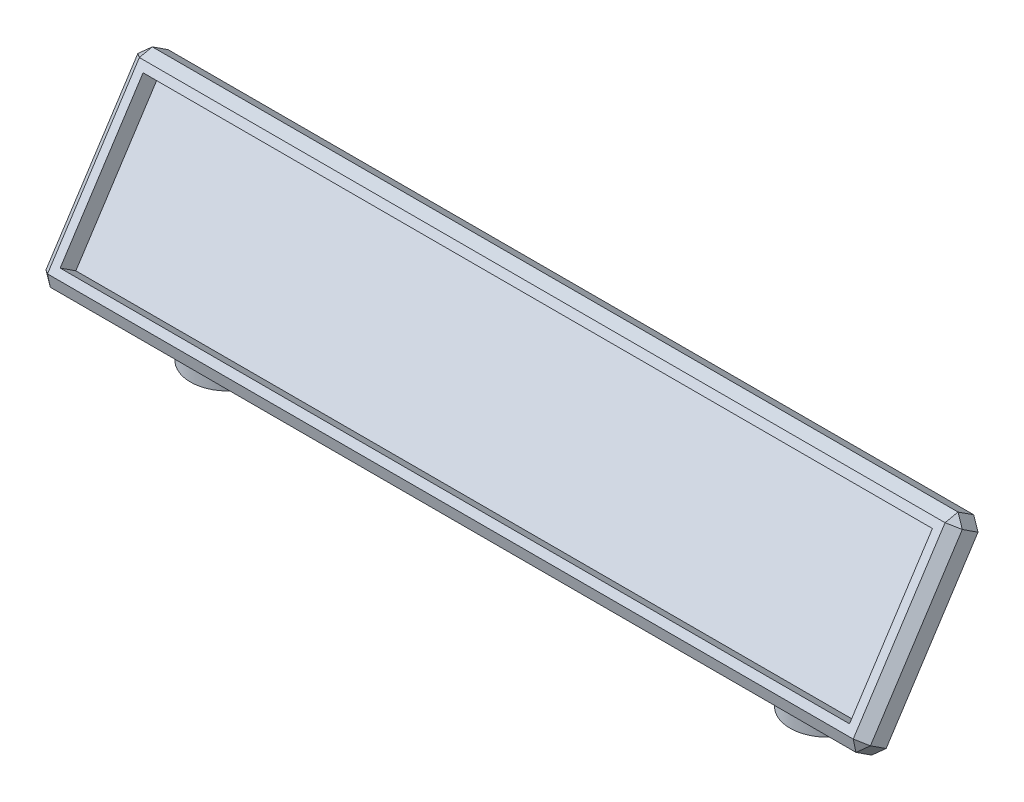
ISO-10303-21;
HEADER;
FILE_DESCRIPTION(('STEP AP214'),'2;1');
FILE_NAME('part.step','',(''),(''),'','','');
FILE_SCHEMA(('AUTOMOTIVE_DESIGN { 1 0 10303 214 1 1 1 1 }'));
ENDSEC;
DATA;
#1=APPLICATION_CONTEXT('core data for automotive mechanical design processes');
#2=APPLICATION_PROTOCOL_DEFINITION('international standard','automotive_design',2000,#1);
#3=PRODUCT_CONTEXT('',#1,'mechanical');
#4=PRODUCT('Part','Part','',(#3));
#5=PRODUCT_RELATED_PRODUCT_CATEGORY('part','',(#4));
#6=PRODUCT_DEFINITION_FORMATION('','',#4);
#7=PRODUCT_DEFINITION_CONTEXT('part definition',#1,'design');
#8=PRODUCT_DEFINITION('design','',#6,#7);
#9=PRODUCT_DEFINITION_SHAPE('','',#8);
#10=(LENGTH_UNIT() NAMED_UNIT(*) SI_UNIT(.MILLI.,.METRE.));
#11=(NAMED_UNIT(*) PLANE_ANGLE_UNIT() SI_UNIT($,.RADIAN.));
#12=(NAMED_UNIT(*) SI_UNIT($,.STERADIAN.) SOLID_ANGLE_UNIT());
#13=UNCERTAINTY_MEASURE_WITH_UNIT(LENGTH_MEASURE(1.E-05),#10,'distance_accuracy_value','');
#14=(GEOMETRIC_REPRESENTATION_CONTEXT(3) GLOBAL_UNCERTAINTY_ASSIGNED_CONTEXT((#13)) GLOBAL_UNIT_ASSIGNED_CONTEXT((#10,
#11,#12)) REPRESENTATION_CONTEXT('',''));
#15=CARTESIAN_POINT('',(0.,0.,0.));
#16=DIRECTION('',(0.,0.,1.));
#17=DIRECTION('',(1.,0.,0.));
#18=AXIS2_PLACEMENT_3D('',#15,#16,#17);
#19=CARTESIAN_POINT('',(0.,5.65083347470303,8.70152048404579));
#20=DIRECTION('',(0.,0.544639035015028,0.838670567945423));
#21=DIRECTION('',(0.,-0.838670567945423,0.544639035015028));
#22=AXIS2_PLACEMENT_3D('',#19,#20,#21);
#23=PLANE('',#22);
#24=DIRECTION('',(-1.,0.,0.));
#25=VECTOR('',#24,1.);
#26=CARTESIAN_POINT('',(-69.85,7.06749426047978,7.78153021277722));
#27=LINE('',#26,#25);
#28=CARTESIAN_POINT('',(68.2625,7.06749426047977,7.78153021277721));
#29=VERTEX_POINT('',#28);
#30=CARTESIAN_POINT('',(-68.2625,7.06749426047978,7.78153021277722));
#31=VERTEX_POINT('',#30);
#32=EDGE_CURVE('E252',#29,#31,#27,.T.);
#33=ORIENTED_EDGE('',*,*,#32,.T.);
#34=DIRECTION('',(0.,0.838670567945423,-0.544639035015028));
#35=VECTOR('',#34,1.);
#36=CARTESIAN_POINT('',(-68.2625,5.65083347470303,8.70152048404579));
#37=LINE('',#36,#35);
#38=CARTESIAN_POINT('',(-68.2625,31.0325057395202,-7.7815302127772));
#39=VERTEX_POINT('',#38);
#40=EDGE_CURVE('E261',#31,#39,#37,.T.);
#41=ORIENTED_EDGE('',*,*,#40,.T.);
#42=DIRECTION('',(1.,0.,0.));
#43=VECTOR('',#42,1.);
#44=CARTESIAN_POINT('',(0.,31.0325057395202,-7.7815302127772));
#45=LINE('',#44,#43);
#46=CARTESIAN_POINT('',(68.2625,31.0325057395202,-7.78153021277721));
#47=VERTEX_POINT('',#46);
#48=EDGE_CURVE('E258',#39,#47,#45,.T.);
#49=ORIENTED_EDGE('',*,*,#48,.T.);
#50=DIRECTION('',(0.,-0.838670567945423,0.544639035015028));
#51=VECTOR('',#50,1.);
#52=CARTESIAN_POINT('',(68.2625,5.73610473386639,8.64614468086358));
#53=LINE('',#52,#51);
#54=EDGE_CURVE('E255',#47,#29,#53,.T.);
#55=ORIENTED_EDGE('',*,*,#54,.T.);
#56=EDGE_LOOP('',(#33,#41,#49,#55));
#57=FACE_BOUND('',#56,.T.);
#58=CARTESIAN_POINT('',(-50.8,19.05,0.));
#59=DIRECTION('',(0.,0.544639035015028,0.838670567945423));
#60=DIRECTION('',(0.,-0.838670567945423,0.544639035015028));
#61=AXIS2_PLACEMENT_3D('',#58,#59,#60);
#62=ELLIPSE('',#61,11.6590982132318,6.35);
#63=CARTESIAN_POINT('',(-50.8,9.27185747977741,6.35000000000002));
#64=VERTEX_POINT('',#63);
#65=EDGE_CURVE('E227',#64,#64,#62,.T.);
#66=ORIENTED_EDGE('',*,*,#65,.T.);
#67=EDGE_LOOP('',(#66));
#68=FACE_BOUND('',#67,.T.);
#69=CARTESIAN_POINT('',(50.8,19.05,0.));
#70=DIRECTION('',(0.,0.544639035015028,0.838670567945423));
#71=DIRECTION('',(0.,-0.838670567945423,0.544639035015028));
#72=AXIS2_PLACEMENT_3D('',#69,#70,#71);
#73=ELLIPSE('',#72,11.6590982132318,6.35);
#74=CARTESIAN_POINT('',(50.8,9.27185747977745,6.34999999999999));
#75=VERTEX_POINT('',#74);
#76=EDGE_CURVE('E235',#75,#75,#73,.F.);
#77=ORIENTED_EDGE('',*,*,#76,.F.);
#78=EDGE_LOOP('',(#77));
#79=FACE_BOUND('',#78,.T.);
#80=ADVANCED_FACE('F49',(#57,#68,#79),#23,.F.);
#81=CARTESIAN_POINT('',(-50.8,19.05,0.));
#82=DIRECTION('',(0.,-1.,0.));
#83=DIRECTION('',(0.,0.,-1.));
#84=AXIS2_PLACEMENT_3D('',#81,#82,#83);
#85=CYLINDRICAL_SURFACE('',#84,6.35);
#86=CARTESIAN_POINT('',(-50.8,0.,0.));
#87=DIRECTION('',(0.,1.,0.));
#88=DIRECTION('',(0.,0.,1.));
#89=AXIS2_PLACEMENT_3D('',#86,#87,#88);
#90=CIRCLE('',#89,6.35);
#91=CARTESIAN_POINT('',(-50.8,0.,6.35000000000002));
#92=VERTEX_POINT('',#91);
#93=EDGE_CURVE('E231',#92,#92,#90,.T.);
#94=ORIENTED_EDGE('',*,*,#93,.T.);
#95=EDGE_LOOP('',(#94));
#96=FACE_BOUND('',#95,.T.);
#97=ORIENTED_EDGE('',*,*,#65,.F.);
#98=EDGE_LOOP('',(#97));
#99=FACE_BOUND('',#98,.T.);
#100=ADVANCED_FACE('F454',(#96,#99),#85,.T.);
#101=CARTESIAN_POINT('',(-50.8,0.,0.));
#102=DIRECTION('',(0.,1.,0.));
#103=DIRECTION('',(0.,0.,1.));
#104=AXIS2_PLACEMENT_3D('',#101,#102,#103);
#105=PLANE('',#104);
#106=CARTESIAN_POINT('',(-50.8,0.,0.));
#107=DIRECTION('',(0.,-1.,0.));
#108=DIRECTION('',(0.,0.,-1.));
#109=AXIS2_PLACEMENT_3D('',#106,#107,#108);
#110=CIRCLE('',#109,3.17500000000001);
#111=CARTESIAN_POINT('',(-50.8,0.,-3.175));
#112=VERTEX_POINT('',#111);
#113=EDGE_CURVE('E1039',#112,#112,#110,.T.);
#114=ORIENTED_EDGE('',*,*,#113,.F.);
#115=EDGE_LOOP('',(#114));
#116=FACE_BOUND('',#115,.T.);
#117=ORIENTED_EDGE('',*,*,#93,.F.);
#118=EDGE_LOOP('',(#117));
#119=FACE_BOUND('',#118,.T.);
#120=ADVANCED_FACE('F460',(#116,#119),#105,.F.);
#121=CARTESIAN_POINT('',(0.,35.822353138479,-3.32058657441013));
#122=DIRECTION('',(0.,-0.838670567945423,0.544639035015028));
#123=DIRECTION('',(0.,-0.544639035015028,-0.838670567945423));
#124=AXIS2_PLACEMENT_3D('',#121,#122,#123);
#125=PLANE('',#124);
#126=DIRECTION('',(0.,-0.544639035015028,-0.838670567945423));
#127=VECTOR('',#126,1.);
#128=CARTESIAN_POINT('',(68.2625,32.3638952661336,-8.64614468086357));
#129=LINE('',#128,#127);
#130=CARTESIAN_POINT('',(68.2625,34.9577386703927,-4.65197610102351));
#131=VERTEX_POINT('',#130);
#132=CARTESIAN_POINT('',(68.2625,33.22850973422,-7.31475515425019));
#133=VERTEX_POINT('',#132);
#134=EDGE_CURVE('E271',#131,#133,#129,.T.);
#135=ORIENTED_EDGE('',*,*,#134,.T.);
#136=DIRECTION('',(-1.,0.,0.));
#137=VECTOR('',#136,1.);
#138=CARTESIAN_POINT('',(0.,33.22850973422,-7.31475515425019));
#139=LINE('',#138,#137);
#140=CARTESIAN_POINT('',(-68.2625,33.22850973422,-7.31475515425018));
#141=VERTEX_POINT('',#140);
#142=EDGE_CURVE('E274',#133,#141,#139,.T.);
#143=ORIENTED_EDGE('',*,*,#142,.T.);
#144=DIRECTION('',(0.,0.544639035015028,0.838670567945423));
#145=VECTOR('',#144,1.);
#146=CARTESIAN_POINT('',(-68.2625,35.822353138479,-3.32058657441013));
#147=LINE('',#146,#145);
#148=CARTESIAN_POINT('',(-68.2625,34.9577386703927,-4.6519761010235));
#149=VERTEX_POINT('',#148);
#150=EDGE_CURVE('E265',#141,#149,#147,.T.);
#151=ORIENTED_EDGE('',*,*,#150,.T.);
#152=DIRECTION('',(1.,0.,0.));
#153=VECTOR('',#152,1.);
#154=CARTESIAN_POINT('',(69.85,34.9577386703927,-4.65197610102351));
#155=LINE('',#154,#153);
#156=EDGE_CURVE('E268',#149,#131,#155,.T.);
#157=ORIENTED_EDGE('',*,*,#156,.T.);
#158=EDGE_LOOP('',(#135,#143,#151,#157));
#159=FACE_BOUND('',#158,.T.);
#160=ADVANCED_FACE('F415',(#159),#125,.F.);
#161=CARTESIAN_POINT('',(-69.85,9.10929134704846,14.0270785904992));
#162=DIRECTION('',(1.,0.,0.));
#163=DIRECTION('',(0.,1.,0.));
#164=AXIS2_PLACEMENT_3D('',#161,#162,#163);
#165=PLANE('',#164);
#166=DIRECTION('',(0.,-0.544639035015028,-0.838670567945423));
#167=VECTOR('',#166,1.);
#168=CARTESIAN_POINT('',(-69.85,34.4909636118657,-2.45597210632377));
#169=LINE('',#168,#167);
#170=CARTESIAN_POINT('',(-69.85,33.6263491437793,-3.78736163293714));
#171=VERTEX_POINT('',#170);
#172=CARTESIAN_POINT('',(-69.85,31.8971202076066,-6.45014068616384));
#173=VERTEX_POINT('',#172);
#174=EDGE_CURVE('E239',#171,#173,#169,.T.);
#175=ORIENTED_EDGE('',*,*,#174,.T.);
#176=DIRECTION('',(0.,-0.838670567945423,0.544639035015028));
#177=VECTOR('',#176,1.);
#178=CARTESIAN_POINT('',(-69.85,6.51544794278939,10.0329100106592));
#179=LINE('',#178,#177);
#180=CARTESIAN_POINT('',(-69.85,7.93210872856614,9.11291973939058));
#181=VERTEX_POINT('',#180);
#182=EDGE_CURVE('E248',#173,#181,#179,.T.);
#183=ORIENTED_EDGE('',*,*,#182,.T.);
#184=DIRECTION('',(0.,0.544639035015028,0.838670567945423));
#185=VECTOR('',#184,1.);
#186=CARTESIAN_POINT('',(-69.85,10.5259521328252,13.1070883192307));
#187=LINE('',#186,#185);
#188=CARTESIAN_POINT('',(-69.85,9.66133766473884,11.7756987926173));
#189=VERTEX_POINT('',#188);
#190=EDGE_CURVE('E245',#181,#189,#187,.T.);
#191=ORIENTED_EDGE('',*,*,#190,.T.);
#192=DIRECTION('',(0.,0.838670567945423,-0.544639035015028));
#193=VECTOR('',#192,1.);
#194=CARTESIAN_POINT('',(-69.85,34.9577386703927,-4.65197610102349));
#195=LINE('',#194,#193);
#196=EDGE_CURVE('E242',#189,#171,#195,.T.);
#197=ORIENTED_EDGE('',*,*,#196,.T.);
#198=EDGE_LOOP('',(#175,#183,#191,#197));
#199=FACE_BOUND('',#198,.T.);
#200=ADVANCED_FACE('F473',(#199),#165,.F.);
#201=CARTESIAN_POINT('',(0.,9.19456260621184,13.971702787317));
#202=DIRECTION('',(0.,-0.838670567945423,0.544639035015028));
#203=DIRECTION('',(0.,-0.544639035015028,-0.838670567945423));
#204=AXIS2_PLACEMENT_3D('',#201,#202,#203);
#205=PLANE('',#204);
#206=DIRECTION('',(-1.,0.,0.));
#207=VECTOR('',#206,1.);
#208=CARTESIAN_POINT('',(0.,8.32994813812548,12.6403132607036));
#209=LINE('',#208,#207);
#210=CARTESIAN_POINT('',(68.2625,8.32994813812547,12.6403132607036));
#211=VERTEX_POINT('',#210);
#212=CARTESIAN_POINT('',(-68.2625,8.32994813812548,12.6403132607036));
#213=VERTEX_POINT('',#212);
#214=EDGE_CURVE('E294',#211,#213,#209,.T.);
#215=ORIENTED_EDGE('',*,*,#214,.T.);
#216=DIRECTION('',(0.,-0.544639035015028,-0.838670567945423));
#217=VECTOR('',#216,1.);
#218=CARTESIAN_POINT('',(-68.2625,5.73610473386641,8.64614468086358));
#219=LINE('',#218,#217);
#220=CARTESIAN_POINT('',(-68.2625,6.60071920195278,9.97753420747695));
#221=VERTEX_POINT('',#220);
#222=EDGE_CURVE('E301',#213,#221,#219,.T.);
#223=ORIENTED_EDGE('',*,*,#222,.T.);
#224=DIRECTION('',(1.,0.,0.));
#225=VECTOR('',#224,1.);
#226=CARTESIAN_POINT('',(69.85,6.60071920195278,9.97753420747695));
#227=LINE('',#226,#225);
#228=CARTESIAN_POINT('',(68.2625,6.60071920195278,9.97753420747695));
#229=VERTEX_POINT('',#228);
#230=EDGE_CURVE('E297',#221,#229,#227,.T.);
#231=ORIENTED_EDGE('',*,*,#230,.T.);
#232=DIRECTION('',(0.,0.544639035015028,0.838670567945423));
#233=VECTOR('',#232,1.);
#234=CARTESIAN_POINT('',(68.2625,9.19456260621184,13.971702787317));
#235=LINE('',#234,#233);
#236=EDGE_CURVE('E291',#229,#211,#235,.T.);
#237=ORIENTED_EDGE('',*,*,#236,.T.);
#238=EDGE_LOOP('',(#215,#223,#231,#237));
#239=FACE_BOUND('',#238,.T.);
#240=ADVANCED_FACE('F437',(#239),#205,.T.);
#241=CARTESIAN_POINT('',(69.85,9.10929134704845,14.0270785904992));
#242=DIRECTION('',(1.,0.,0.));
#243=DIRECTION('',(0.,1.,0.));
#244=AXIS2_PLACEMENT_3D('',#241,#242,#243);
#245=PLANE('',#244);
#246=DIRECTION('',(0.,-0.544639035015028,-0.838670567945423));
#247=VECTOR('',#246,1.);
#248=CARTESIAN_POINT('',(69.85,10.5259521328252,13.1070883192306));
#249=LINE('',#248,#247);
#250=CARTESIAN_POINT('',(69.85,9.66133766473884,11.7756987926173));
#251=VERTEX_POINT('',#250);
#252=CARTESIAN_POINT('',(69.85,7.93210872856614,9.11291973939058));
#253=VERTEX_POINT('',#252);
#254=EDGE_CURVE('E284',#251,#253,#249,.T.);
#255=ORIENTED_EDGE('',*,*,#254,.T.);
#256=DIRECTION('',(0.,0.838670567945423,-0.544639035015028));
#257=VECTOR('',#256,1.);
#258=CARTESIAN_POINT('',(69.85,33.22850973422,-7.31475515425019));
#259=LINE('',#258,#257);
#260=CARTESIAN_POINT('',(69.85,31.8971202076066,-6.45014068616383));
#261=VERTEX_POINT('',#260);
#262=EDGE_CURVE('E287',#253,#261,#259,.T.);
#263=ORIENTED_EDGE('',*,*,#262,.T.);
#264=DIRECTION('',(0.,0.544639035015028,0.838670567945423));
#265=VECTOR('',#264,1.);
#266=CARTESIAN_POINT('',(69.85,34.4909636118657,-2.45597210632377));
#267=LINE('',#266,#265);
#268=CARTESIAN_POINT('',(69.85,33.6263491437793,-3.78736163293714));
#269=VERTEX_POINT('',#268);
#270=EDGE_CURVE('E278',#261,#269,#267,.T.);
#271=ORIENTED_EDGE('',*,*,#270,.T.);
#272=DIRECTION('',(0.,-0.838670567945423,0.544639035015028));
#273=VECTOR('',#272,1.);
#274=CARTESIAN_POINT('',(69.85,8.24467687896209,12.6956890638859));
#275=LINE('',#274,#273);
#276=EDGE_CURVE('E281',#269,#251,#275,.T.);
#277=ORIENTED_EDGE('',*,*,#276,.T.);
#278=EDGE_LOOP('',(#255,#263,#271,#277));
#279=FACE_BOUND('',#278,.T.);
#280=ADVANCED_FACE('F467',(#279),#245,.T.);
#281=CARTESIAN_POINT('',(0.,9.10929134704845,14.0270785904992));
#282=DIRECTION('',(0.,0.544639035015028,0.838670567945423));
#283=DIRECTION('',(0.,-0.838670567945423,0.544639035015028));
#284=AXIS2_PLACEMENT_3D('',#281,#282,#283);
#285=PLANE('',#284);
#286=DIRECTION('',(0.,-0.838670567945423,0.544639035015028));
#287=VECTOR('',#286,1.);
#288=CARTESIAN_POINT('',(-68.2625,9.19456260621184,13.971702787317));
#289=LINE('',#288,#287);
#290=CARTESIAN_POINT('',(-68.2625,34.4909636118657,-2.45597210632377));
#291=VERTEX_POINT('',#290);
#292=CARTESIAN_POINT('',(-68.2625,10.5259521328252,13.1070883192306));
#293=VERTEX_POINT('',#292);
#294=EDGE_CURVE('E60',#291,#293,#289,.T.);
#295=ORIENTED_EDGE('',*,*,#294,.T.);
#296=DIRECTION('',(1.,0.,0.));
#297=VECTOR('',#296,1.);
#298=CARTESIAN_POINT('',(0.,10.5259521328252,13.1070883192306));
#299=LINE('',#298,#297);
#300=CARTESIAN_POINT('',(68.2625,10.5259521328252,13.1070883192306));
#301=VERTEX_POINT('',#300);
#302=EDGE_CURVE('E11',#293,#301,#299,.T.);
#303=ORIENTED_EDGE('',*,*,#302,.T.);
#304=DIRECTION('',(0.,0.838670567945423,-0.544639035015028));
#305=VECTOR('',#304,1.);
#306=CARTESIAN_POINT('',(68.2625,9.10929134704845,14.0270785904992));
#307=LINE('',#306,#305);
#308=CARTESIAN_POINT('',(68.2625,34.4909636118657,-2.45597210632377));
#309=VERTEX_POINT('',#308);
#310=EDGE_CURVE('E307',#301,#309,#307,.T.);
#311=ORIENTED_EDGE('',*,*,#310,.T.);
#312=DIRECTION('',(-1.,0.,0.));
#313=VECTOR('',#312,1.);
#314=CARTESIAN_POINT('',(-69.85,34.4909636118657,-2.45597210632376));
#315=LINE('',#314,#313);
#316=EDGE_CURVE('E304',#309,#291,#315,.T.);
#317=ORIENTED_EDGE('',*,*,#316,.T.);
#318=EDGE_LOOP('',(#295,#303,#311,#317));
#319=FACE_BOUND('',#318,.T.);
#320=DIRECTION('',(0.,0.838670567945423,-0.544639035015028));
#321=VECTOR('',#320,1.);
#322=CARTESIAN_POINT('',(66.875,11.6896075458495,12.3514016581473));
#323=LINE('',#322,#321);
#324=CARTESIAN_POINT('',(66.875,11.6896075458495,12.3514016581473));
#325=VERTEX_POINT('',#324);
#326=CARTESIAN_POINT('',(66.875,33.3273081988414,-1.70028544524043));
#327=VERTEX_POINT('',#326);
#328=EDGE_CURVE('E173',#325,#327,#323,.T.);
#329=ORIENTED_EDGE('',*,*,#328,.F.);
#330=DIRECTION('',(1.,0.,0.));
#331=VECTOR('',#330,1.);
#332=CARTESIAN_POINT('',(-66.875,11.6896075458495,12.3514016581473));
#333=LINE('',#332,#331);
#334=CARTESIAN_POINT('',(-66.875,11.6896075458495,12.3514016581473));
#335=VERTEX_POINT('',#334);
#336=EDGE_CURVE('E193',#335,#325,#333,.T.);
#337=ORIENTED_EDGE('',*,*,#336,.F.);
#338=DIRECTION('',(0.,-0.838670567945423,0.544639035015028));
#339=VECTOR('',#338,1.);
#340=CARTESIAN_POINT('',(-66.875,33.3273081988414,-1.70028544524042));
#341=LINE('',#340,#339);
#342=CARTESIAN_POINT('',(-66.875,33.3273081988414,-1.70028544524042));
#343=VERTEX_POINT('',#342);
#344=EDGE_CURVE('E197',#343,#335,#341,.T.);
#345=ORIENTED_EDGE('',*,*,#344,.F.);
#346=DIRECTION('',(-1.,0.,0.));
#347=VECTOR('',#346,1.);
#348=CARTESIAN_POINT('',(66.875,33.3273081988414,-1.70028544524042));
#349=LINE('',#348,#347);
#350=EDGE_CURVE('E209',#327,#343,#349,.T.);
#351=ORIENTED_EDGE('',*,*,#350,.F.);
#352=EDGE_LOOP('',(#329,#337,#345,#351));
#353=FACE_BOUND('',#352,.T.);
#354=ADVANCED_FACE('F422',(#319,#353),#285,.T.);
#355=CARTESIAN_POINT('',(50.8,19.05,0.));
#356=DIRECTION('',(0.,-1.,0.));
#357=DIRECTION('',(0.,0.,-1.));
#358=AXIS2_PLACEMENT_3D('',#355,#356,#357);
#359=CYLINDRICAL_SURFACE('',#358,6.35);
#360=CARTESIAN_POINT('',(50.8,0.,0.));
#361=DIRECTION('',(0.,1.,0.));
#362=DIRECTION('',(0.,0.,1.));
#363=AXIS2_PLACEMENT_3D('',#360,#361,#362);
#364=CIRCLE('',#363,6.35);
#365=CARTESIAN_POINT('',(50.8,0.,6.34999999999999));
#366=VERTEX_POINT('',#365);
#367=EDGE_CURVE('E218',#366,#366,#364,.T.);
#368=ORIENTED_EDGE('',*,*,#367,.T.);
#369=EDGE_LOOP('',(#368));
#370=FACE_BOUND('',#369,.T.);
#371=ORIENTED_EDGE('',*,*,#76,.T.);
#372=EDGE_LOOP('',(#371));
#373=FACE_BOUND('',#372,.T.);
#374=ADVANCED_FACE('F906',(#370,#373),#359,.T.);
#375=CARTESIAN_POINT('',(50.8,0.,0.));
#376=DIRECTION('',(0.,1.,0.));
#377=DIRECTION('',(0.,0.,1.));
#378=AXIS2_PLACEMENT_3D('',#375,#376,#377);
#379=PLANE('',#378);
#380=CARTESIAN_POINT('',(50.8,0.,0.));
#381=DIRECTION('',(0.,-1.,0.));
#382=DIRECTION('',(0.,0.,-1.));
#383=AXIS2_PLACEMENT_3D('',#380,#381,#382);
#384=CIRCLE('',#383,3.17500000000001);
#385=CARTESIAN_POINT('',(50.8,0.,-3.17500000000003));
#386=VERTEX_POINT('',#385);
#387=EDGE_CURVE('E1004',#386,#386,#384,.T.);
#388=ORIENTED_EDGE('',*,*,#387,.F.);
#389=EDGE_LOOP('',(#388));
#390=FACE_BOUND('',#389,.T.);
#391=ORIENTED_EDGE('',*,*,#367,.F.);
#392=EDGE_LOOP('',(#391));
#393=FACE_BOUND('',#392,.T.);
#394=ADVANCED_FACE('F900',(#390,#393),#379,.F.);
#395=CARTESIAN_POINT('',(66.875,9.96037860967674,9.6886226049206));
#396=DIRECTION('',(1.,0.,0.));
#397=DIRECTION('',(0.,0.,-1.));
#398=AXIS2_PLACEMENT_3D('',#395,#396,#397);
#399=PLANE('',#398);
#400=ORIENTED_EDGE('',*,*,#328,.T.);
#401=DIRECTION('',(0.,0.544639035015028,0.838670567945423));
#402=VECTOR('',#401,1.);
#403=CARTESIAN_POINT('',(66.875,31.5980792626687,-4.36306449846714));
#404=LINE('',#403,#402);
#405=CARTESIAN_POINT('',(66.875,31.5980792626687,-4.36306449846714));
#406=VERTEX_POINT('',#405);
#407=EDGE_CURVE('E166',#406,#327,#404,.T.);
#408=ORIENTED_EDGE('',*,*,#407,.F.);
#409=DIRECTION('',(0.,0.838670567945423,-0.544639035015028));
#410=VECTOR('',#409,1.);
#411=CARTESIAN_POINT('',(66.875,9.96037860967674,9.6886226049206));
#412=LINE('',#411,#410);
#413=CARTESIAN_POINT('',(66.875,9.96037860967674,9.6886226049206));
#414=VERTEX_POINT('',#413);
#415=EDGE_CURVE('E170',#414,#406,#412,.T.);
#416=ORIENTED_EDGE('',*,*,#415,.F.);
#417=DIRECTION('',(0.,0.544639035015028,0.838670567945423));
#418=VECTOR('',#417,1.);
#419=CARTESIAN_POINT('',(66.875,9.96037860967674,9.6886226049206));
#420=LINE('',#419,#418);
#421=EDGE_CURVE('E215',#414,#325,#420,.T.);
#422=ORIENTED_EDGE('',*,*,#421,.T.);
#423=EDGE_LOOP('',(#400,#408,#416,#422));
#424=FACE_BOUND('',#423,.T.);
#425=ADVANCED_FACE('F168',(#424),#399,.F.);
#426=CARTESIAN_POINT('',(-66.875,9.96037860967676,9.68862260492059));
#427=DIRECTION('',(0.,-0.838670567945423,0.544639035015028));
#428=DIRECTION('',(0.,-0.544639035015028,-0.838670567945423));
#429=AXIS2_PLACEMENT_3D('',#426,#427,#428);
#430=PLANE('',#429);
#431=ORIENTED_EDGE('',*,*,#336,.T.);
#432=ORIENTED_EDGE('',*,*,#421,.F.);
#433=DIRECTION('',(1.,0.,0.));
#434=VECTOR('',#433,1.);
#435=CARTESIAN_POINT('',(-66.875,9.96037860967676,9.68862260492059));
#436=LINE('',#435,#434);
#437=CARTESIAN_POINT('',(-66.875,9.96037860967676,9.68862260492059));
#438=VERTEX_POINT('',#437);
#439=EDGE_CURVE('E179',#438,#414,#436,.T.);
#440=ORIENTED_EDGE('',*,*,#439,.F.);
#441=DIRECTION('',(0.,0.544639035015028,0.838670567945423));
#442=VECTOR('',#441,1.);
#443=CARTESIAN_POINT('',(-66.875,9.96037860967676,9.68862260492059));
#444=LINE('',#443,#442);
#445=EDGE_CURVE('E219',#438,#335,#444,.T.);
#446=ORIENTED_EDGE('',*,*,#445,.T.);
#447=EDGE_LOOP('',(#431,#432,#440,#446));
#448=FACE_BOUND('',#447,.T.);
#449=ADVANCED_FACE('F879',(#448),#430,.F.);
#450=CARTESIAN_POINT('',(-66.875,31.5980792626687,-4.36306449846714));
#451=DIRECTION('',(-1.,0.,0.));
#452=DIRECTION('',(0.,0.,1.));
#453=AXIS2_PLACEMENT_3D('',#450,#451,#452);
#454=PLANE('',#453);
#455=ORIENTED_EDGE('',*,*,#344,.T.);
#456=ORIENTED_EDGE('',*,*,#445,.F.);
#457=DIRECTION('',(0.,-0.838670567945423,0.544639035015028));
#458=VECTOR('',#457,1.);
#459=CARTESIAN_POINT('',(-66.875,31.5980792626687,-4.36306449846714));
#460=LINE('',#459,#458);
#461=CARTESIAN_POINT('',(-66.875,31.5980792626687,-4.36306449846714));
#462=VERTEX_POINT('',#461);
#463=EDGE_CURVE('E188',#462,#438,#460,.T.);
#464=ORIENTED_EDGE('',*,*,#463,.F.);
#465=DIRECTION('',(0.,0.544639035015028,0.838670567945423));
#466=VECTOR('',#465,1.);
#467=CARTESIAN_POINT('',(-66.875,31.5980792626687,-4.36306449846714));
#468=LINE('',#467,#466);
#469=EDGE_CURVE('E178',#462,#343,#468,.T.);
#470=ORIENTED_EDGE('',*,*,#469,.T.);
#471=EDGE_LOOP('',(#455,#456,#464,#470));
#472=FACE_BOUND('',#471,.T.);
#473=ADVANCED_FACE('F869',(#472),#454,.F.);
#474=CARTESIAN_POINT('',(66.875,31.5980792626687,-4.36306449846714));
#475=DIRECTION('',(0.,0.838670567945423,-0.544639035015028));
#476=DIRECTION('',(0.,0.544639035015028,0.838670567945423));
#477=AXIS2_PLACEMENT_3D('',#474,#475,#476);
#478=PLANE('',#477);
#479=ORIENTED_EDGE('',*,*,#350,.T.);
#480=ORIENTED_EDGE('',*,*,#469,.F.);
#481=DIRECTION('',(-1.,0.,0.));
#482=VECTOR('',#481,1.);
#483=CARTESIAN_POINT('',(66.875,31.5980792626687,-4.36306449846714));
#484=LINE('',#483,#482);
#485=EDGE_CURVE('E182',#406,#462,#484,.T.);
#486=ORIENTED_EDGE('',*,*,#485,.F.);
#487=ORIENTED_EDGE('',*,*,#407,.T.);
#488=EDGE_LOOP('',(#479,#480,#486,#487));
#489=FACE_BOUND('',#488,.T.);
#490=ADVANCED_FACE('F183',(#489),#478,.F.);
#491=CARTESIAN_POINT('',(0.,7.38006241087575,11.3642995372725));
#492=DIRECTION('',(0.,0.544639035015028,0.838670567945423));
#493=DIRECTION('',(0.,-0.838670567945423,0.544639035015028));
#494=AXIS2_PLACEMENT_3D('',#491,#492,#493);
#495=PLANE('',#494);
#496=ORIENTED_EDGE('',*,*,#415,.T.);
#497=ORIENTED_EDGE('',*,*,#485,.T.);
#498=ORIENTED_EDGE('',*,*,#463,.T.);
#499=ORIENTED_EDGE('',*,*,#439,.T.);
#500=EDGE_LOOP('',(#496,#497,#498,#499));
#501=FACE_BOUND('',#500,.T.);
#502=ADVANCED_FACE('F190',(#501),#495,.T.);
#503=CARTESIAN_POINT('',(69.85,8.24467687896209,12.6956890638859));
#504=DIRECTION('',(-0.707106781186546,-0.385117954958025,-0.593029645775783));
#505=DIRECTION('',(0.,-0.838670567945423,0.544639035015028));
#506=AXIS2_PLACEMENT_3D('',#503,#504,#505);
#507=PLANE('',#506);
#508=DIRECTION('',(-0.707106781186549,0.385117954958026,0.593029645775779));
#509=VECTOR('',#508,1.);
#510=CARTESIAN_POINT('',(68.2625,34.4909636118657,-2.45597210632377));
#511=LINE('',#510,#509);
#512=EDGE_CURVE('E54',#309,#269,#511,.F.);
#513=ORIENTED_EDGE('',*,*,#512,.F.);
#514=ORIENTED_EDGE('',*,*,#310,.F.);
#515=DIRECTION('',(0.707106781186549,-0.385117954958026,-0.593029645775778));
#516=VECTOR('',#515,1.);
#517=CARTESIAN_POINT('',(68.2625,10.5259521328252,13.1070883192306));
#518=LINE('',#517,#516);
#519=EDGE_CURVE('E392',#251,#301,#518,.F.);
#520=ORIENTED_EDGE('',*,*,#519,.F.);
#521=ORIENTED_EDGE('',*,*,#276,.F.);
#522=EDGE_LOOP('',(#513,#514,#520,#521));
#523=FACE_BOUND('',#522,.T.);
#524=ADVANCED_FACE('F52',(#523),#507,.F.);
#525=CARTESIAN_POINT('',(68.2625,34.4909636118657,-2.45597210632377));
#526=DIRECTION('',(0.577350269189624,0.798654171641813,0.169759184687599));
#527=DIRECTION('',(-0.810416906773853,0.585853597083009,0.));
#528=AXIS2_PLACEMENT_3D('',#525,#526,#527);
#529=PLANE('',#528);
#530=DIRECTION('',(0.,-0.207911690817754,0.978147600733807));
#531=VECTOR('',#530,1.);
#532=CARTESIAN_POINT('',(68.2625,34.4909636118657,-2.45597210632377));
#533=LINE('',#532,#531);
#534=EDGE_CURVE('E385',#309,#131,#533,.F.);
#535=ORIENTED_EDGE('',*,*,#534,.F.);
#536=ORIENTED_EDGE('',*,*,#512,.T.);
#537=DIRECTION('',(-0.707106781186551,0.59302964577578,-0.385117954958022));
#538=VECTOR('',#537,1.);
#539=CARTESIAN_POINT('',(69.05625,34.292043907086,-4.21966886698033));
#540=LINE('',#539,#538);
#541=EDGE_CURVE('E389',#131,#269,#540,.F.);
#542=ORIENTED_EDGE('',*,*,#541,.F.);
#543=EDGE_LOOP('',(#535,#536,#542));
#544=FACE_BOUND('',#543,.T.);
#545=ADVANCED_FACE('F404',(#544),#529,.T.);
#546=CARTESIAN_POINT('',(68.2625,10.5259521328252,13.1070883192306));
#547=DIRECTION('',(0.577350269189623,-0.1697591846876,0.798654171641814));
#548=DIRECTION('',(0.810416906773854,0.,-0.585853597083007));
#549=AXIS2_PLACEMENT_3D('',#546,#547,#548);
#550=PLANE('',#549);
#551=DIRECTION('',(-0.707106781186549,-0.59302964577578,0.385117954958023));
#552=VECTOR('',#551,1.);
#553=CARTESIAN_POINT('',(69.05625,8.99564290143215,12.2080060266605));
#554=LINE('',#553,#552);
#555=EDGE_CURVE('E379',#251,#211,#554,.T.);
#556=ORIENTED_EDGE('',*,*,#555,.F.);
#557=ORIENTED_EDGE('',*,*,#519,.T.);
#558=DIRECTION('',(0.,0.978147600733806,0.207911690817755));
#559=VECTOR('',#558,1.);
#560=CARTESIAN_POINT('',(68.2625,10.5259521328252,13.1070883192306));
#561=LINE('',#560,#559);
#562=EDGE_CURVE('E73',#211,#301,#561,.T.);
#563=ORIENTED_EDGE('',*,*,#562,.F.);
#564=EDGE_LOOP('',(#556,#557,#563));
#565=FACE_BOUND('',#564,.T.);
#566=ADVANCED_FACE('F444',(#565),#550,.T.);
#567=CARTESIAN_POINT('',(68.2625,35.822353138479,-3.32058657441013));
#568=DIRECTION('',(0.707106781186544,0.593029645775785,-0.385117954958026));
#569=DIRECTION('',(0.,0.544639035015028,0.838670567945423));
#570=AXIS2_PLACEMENT_3D('',#567,#568,#569);
#571=PLANE('',#570);
#572=ORIENTED_EDGE('',*,*,#541,.T.);
#573=ORIENTED_EDGE('',*,*,#270,.F.);
#574=DIRECTION('',(0.707106781186551,-0.59302964577578,0.385117954958022));
#575=VECTOR('',#574,1.);
#576=CARTESIAN_POINT('',(69.05625,32.5628149709133,-6.88244792020701));
#577=LINE('',#576,#575);
#578=EDGE_CURVE('E372',#133,#261,#577,.T.);
#579=ORIENTED_EDGE('',*,*,#578,.F.);
#580=ORIENTED_EDGE('',*,*,#134,.F.);
#581=EDGE_LOOP('',(#572,#573,#579,#580));
#582=FACE_BOUND('',#581,.T.);
#583=ADVANCED_FACE('F411',(#582),#571,.T.);
#584=CARTESIAN_POINT('',(0.,34.4909636118657,-2.45597210632377));
#585=DIRECTION('',(0.,0.978147600733807,0.207911690817754));
#586=DIRECTION('',(1.,0.,0.));
#587=AXIS2_PLACEMENT_3D('',#584,#585,#586);
#588=PLANE('',#587);
#589=ORIENTED_EDGE('',*,*,#534,.T.);
#590=ORIENTED_EDGE('',*,*,#156,.F.);
#591=DIRECTION('',(0.,0.207911690817754,-0.978147600733807));
#592=VECTOR('',#591,1.);
#593=CARTESIAN_POINT('',(-68.2625,34.7243511411292,-3.55397410367364));
#594=LINE('',#593,#592);
#595=EDGE_CURVE('E368',#291,#149,#594,.T.);
#596=ORIENTED_EDGE('',*,*,#595,.F.);
#597=ORIENTED_EDGE('',*,*,#316,.F.);
#598=EDGE_LOOP('',(#589,#590,#596,#597));
#599=FACE_BOUND('',#598,.T.);
#600=ADVANCED_FACE('F421',(#599),#588,.T.);
#601=CARTESIAN_POINT('',(-68.2625,9.10929134704846,14.0270785904992));
#602=DIRECTION('',(-0.707106781186546,0.385117954958025,0.593029645775783));
#603=DIRECTION('',(0.,0.838670567945423,-0.544639035015028));
#604=AXIS2_PLACEMENT_3D('',#601,#602,#603);
#605=PLANE('',#604);
#606=DIRECTION('',(-0.707106781186549,-0.385117954958025,-0.593029645775779));
#607=VECTOR('',#606,1.);
#608=CARTESIAN_POINT('',(-69.05625,10.093644898782,12.441393555924));
#609=LINE('',#608,#607);
#610=EDGE_CURVE('E360',#293,#189,#609,.T.);
#611=ORIENTED_EDGE('',*,*,#610,.F.);
#612=ORIENTED_EDGE('',*,*,#294,.F.);
#613=DIRECTION('',(0.707106781186549,0.385117954958022,0.593029645775781));
#614=VECTOR('',#613,1.);
#615=CARTESIAN_POINT('',(-69.85,33.6263491437793,-3.78736163293714));
#616=LINE('',#615,#614);
#617=EDGE_CURVE('E364',#171,#291,#616,.T.);
#618=ORIENTED_EDGE('',*,*,#617,.F.);
#619=ORIENTED_EDGE('',*,*,#196,.F.);
#620=EDGE_LOOP('',(#611,#612,#618,#619));
#621=FACE_BOUND('',#620,.T.);
#622=ADVANCED_FACE('F427',(#621),#605,.T.);
#623=CARTESIAN_POINT('',(0.,8.32994813812547,12.6403132607036));
#624=DIRECTION('',(0.,0.207911690817755,-0.978147600733807));
#625=DIRECTION('',(-1.,0.,0.));
#626=AXIS2_PLACEMENT_3D('',#623,#624,#625);
#627=PLANE('',#626);
#628=ORIENTED_EDGE('',*,*,#562,.T.);
#629=ORIENTED_EDGE('',*,*,#302,.F.);
#630=DIRECTION('',(0.,-0.978147600733807,-0.207911690817755));
#631=VECTOR('',#630,1.);
#632=CARTESIAN_POINT('',(-68.2625,8.32994813812548,12.6403132607036));
#633=LINE('',#632,#631);
#634=EDGE_CURVE('E356',#213,#293,#633,.F.);
#635=ORIENTED_EDGE('',*,*,#634,.F.);
#636=ORIENTED_EDGE('',*,*,#214,.F.);
#637=EDGE_LOOP('',(#628,#629,#635,#636));
#638=FACE_BOUND('',#637,.T.);
#639=ADVANCED_FACE('F435',(#638),#627,.F.);
#640=CARTESIAN_POINT('',(69.85,10.5259521328252,13.1070883192306));
#641=DIRECTION('',(-0.707106781186546,0.593029645775784,-0.385117954958025));
#642=DIRECTION('',(0.,-0.544639035015028,-0.838670567945423));
#643=AXIS2_PLACEMENT_3D('',#640,#641,#642);
#644=PLANE('',#643);
#645=ORIENTED_EDGE('',*,*,#555,.T.);
#646=ORIENTED_EDGE('',*,*,#236,.F.);
#647=DIRECTION('',(0.707106781186549,0.59302964577578,-0.385117954958023));
#648=VECTOR('',#647,1.);
#649=CARTESIAN_POINT('',(69.05625,7.26641396525946,9.54522697343377));
#650=LINE('',#649,#648);
#651=EDGE_CURVE('E352',#253,#229,#650,.F.);
#652=ORIENTED_EDGE('',*,*,#651,.F.);
#653=ORIENTED_EDGE('',*,*,#254,.F.);
#654=EDGE_LOOP('',(#645,#646,#652,#653));
#655=FACE_BOUND('',#654,.T.);
#656=ADVANCED_FACE('F443',(#655),#644,.F.);
#657=CARTESIAN_POINT('',(68.2625,5.65083347470302,8.70152048404578));
#658=DIRECTION('',(0.707106781186551,-0.385117954958022,-0.593029645775779));
#659=DIRECTION('',(0.,0.838670567945423,-0.544639035015028));
#660=AXIS2_PLACEMENT_3D('',#657,#658,#659);
#661=PLANE('',#660);
#662=DIRECTION('',(-0.707106781186544,-0.385117954958028,-0.593029645775784));
#663=VECTOR('',#662,1.);
#664=CARTESIAN_POINT('',(68.2625,31.0325057395202,-7.78153021277721));
#665=LINE('',#664,#663);
#666=EDGE_CURVE('E375',#261,#47,#665,.T.);
#667=ORIENTED_EDGE('',*,*,#666,.F.);
#668=ORIENTED_EDGE('',*,*,#262,.F.);
#669=DIRECTION('',(0.707106781186544,0.385117954958026,0.593029645775785));
#670=VECTOR('',#669,1.);
#671=CARTESIAN_POINT('',(68.2625,7.06749426047977,7.78153021277721));
#672=LINE('',#671,#670);
#673=EDGE_CURVE('E348',#29,#253,#672,.T.);
#674=ORIENTED_EDGE('',*,*,#673,.F.);
#675=ORIENTED_EDGE('',*,*,#54,.F.);
#676=EDGE_LOOP('',(#667,#668,#674,#675));
#677=FACE_BOUND('',#676,.T.);
#678=ADVANCED_FACE('F558',(#677),#661,.T.);
#679=CARTESIAN_POINT('',(68.2625,31.0325057395202,-7.78153021277721));
#680=DIRECTION('',(0.577350269189625,0.169759184687609,-0.79865417164181));
#681=DIRECTION('',(-0.810416906773852,0.,-0.585853597083011));
#682=AXIS2_PLACEMENT_3D('',#679,#680,#681);
#683=PLANE('',#682);
#684=ORIENTED_EDGE('',*,*,#578,.T.);
#685=ORIENTED_EDGE('',*,*,#666,.T.);
#686=DIRECTION('',(0.,-0.978147600733805,-0.207911690817762));
#687=VECTOR('',#686,1.);
#688=CARTESIAN_POINT('',(68.2625,31.0325057395202,-7.78153021277721));
#689=LINE('',#688,#687);
#690=EDGE_CURVE('E344',#133,#47,#689,.T.);
#691=ORIENTED_EDGE('',*,*,#690,.F.);
#692=EDGE_LOOP('',(#684,#685,#691));
#693=FACE_BOUND('',#692,.T.);
#694=ADVANCED_FACE('F551',(#693),#683,.T.);
#695=CARTESIAN_POINT('',(-69.85,33.6263491437793,-3.78736163293714));
#696=DIRECTION('',(-0.577350269189622,0.798654171641814,0.1697591846876));
#697=DIRECTION('',(-0.810416906773855,-0.585853597083006,0.));
#698=AXIS2_PLACEMENT_3D('',#695,#696,#697);
#699=PLANE('',#698);
#700=ORIENTED_EDGE('',*,*,#617,.T.);
#701=ORIENTED_EDGE('',*,*,#595,.T.);
#702=DIRECTION('',(0.707106781186551,0.593029645775778,-0.385117954958024));
#703=VECTOR('',#702,1.);
#704=CARTESIAN_POINT('',(-69.85,33.6263491437793,-3.78736163293714));
#705=LINE('',#704,#703);
#706=EDGE_CURVE('E340',#171,#149,#705,.T.);
#707=ORIENTED_EDGE('',*,*,#706,.F.);
#708=EDGE_LOOP('',(#700,#701,#707));
#709=FACE_BOUND('',#708,.T.);
#710=ADVANCED_FACE('F545',(#709),#699,.T.);
#711=CARTESIAN_POINT('',(-68.2625,8.32994813812548,12.6403132607036));
#712=DIRECTION('',(-0.577350269189624,-0.1697591846876,0.798654171641813));
#713=DIRECTION('',(0.810416906773853,0.,0.585853597083008));
#714=AXIS2_PLACEMENT_3D('',#711,#712,#713);
#715=PLANE('',#714);
#716=ORIENTED_EDGE('',*,*,#634,.T.);
#717=ORIENTED_EDGE('',*,*,#610,.T.);
#718=DIRECTION('',(0.707106781186549,-0.59302964577578,0.385117954958024));
#719=VECTOR('',#718,1.);
#720=CARTESIAN_POINT('',(-68.2625,8.32994813812548,12.6403132607036));
#721=LINE('',#720,#719);
#722=EDGE_CURVE('E336',#213,#189,#721,.F.);
#723=ORIENTED_EDGE('',*,*,#722,.F.);
#724=EDGE_LOOP('',(#716,#717,#723));
#725=FACE_BOUND('',#724,.T.);
#726=ADVANCED_FACE('F433',(#725),#715,.T.);
#727=CARTESIAN_POINT('',(68.2625,7.06749426047977,7.78153021277721));
#728=DIRECTION('',(0.577350269189627,-0.798654171641812,-0.169759184687595));
#729=DIRECTION('',(0.810416906773851,0.585853597083011,0.));
#730=AXIS2_PLACEMENT_3D('',#727,#728,#729);
#731=PLANE('',#730);
#732=ORIENTED_EDGE('',*,*,#673,.T.);
#733=ORIENTED_EDGE('',*,*,#651,.T.);
#734=DIRECTION('',(0.,0.207911690817755,-0.978147600733807));
#735=VECTOR('',#734,1.);
#736=CARTESIAN_POINT('',(68.2625,7.06749426047977,7.78153021277721));
#737=LINE('',#736,#735);
#738=EDGE_CURVE('E333',#29,#229,#737,.F.);
#739=ORIENTED_EDGE('',*,*,#738,.F.);
#740=EDGE_LOOP('',(#732,#733,#739));
#741=FACE_BOUND('',#740,.T.);
#742=ADVANCED_FACE('F532',(#741),#731,.T.);
#743=CARTESIAN_POINT('',(0.,33.22850973422,-7.31475515425019));
#744=DIRECTION('',(0.,-0.207911690817762,0.978147600733805));
#745=DIRECTION('',(-1.,0.,0.));
#746=AXIS2_PLACEMENT_3D('',#743,#744,#745);
#747=PLANE('',#746);
#748=ORIENTED_EDGE('',*,*,#690,.T.);
#749=ORIENTED_EDGE('',*,*,#48,.F.);
#750=DIRECTION('',(0.,0.978147600733805,0.207911690817762));
#751=VECTOR('',#750,1.);
#752=CARTESIAN_POINT('',(-68.2625,31.0325057395202,-7.7815302127772));
#753=LINE('',#752,#751);
#754=EDGE_CURVE('E329',#141,#39,#753,.F.);
#755=ORIENTED_EDGE('',*,*,#754,.F.);
#756=ORIENTED_EDGE('',*,*,#142,.F.);
#757=EDGE_LOOP('',(#748,#749,#755,#756));
#758=FACE_BOUND('',#757,.T.);
#759=ADVANCED_FACE('F525',(#758),#747,.F.);
#760=CARTESIAN_POINT('',(-69.85,34.4909636118657,-2.45597210632376));
#761=DIRECTION('',(0.707106781186544,-0.593029645775785,0.385117954958026));
#762=DIRECTION('',(0.,-0.544639035015028,-0.838670567945423));
#763=AXIS2_PLACEMENT_3D('',#760,#761,#762);
#764=PLANE('',#763);
#765=ORIENTED_EDGE('',*,*,#706,.T.);
#766=ORIENTED_EDGE('',*,*,#150,.F.);
#767=DIRECTION('',(-0.707106781186551,-0.593029645775782,0.385117954958017));
#768=VECTOR('',#767,1.);
#769=CARTESIAN_POINT('',(-69.05625,32.5628149709133,-6.88244792020701));
#770=LINE('',#769,#768);
#771=EDGE_CURVE('E326',#173,#141,#770,.F.);
#772=ORIENTED_EDGE('',*,*,#771,.F.);
#773=ORIENTED_EDGE('',*,*,#174,.F.);
#774=EDGE_LOOP('',(#765,#766,#772,#773));
#775=FACE_BOUND('',#774,.T.);
#776=ADVANCED_FACE('F518',(#775),#764,.F.);
#777=CARTESIAN_POINT('',(-68.2625,9.19456260621184,13.971702787317));
#778=DIRECTION('',(-0.707106781186546,-0.593029645775783,0.385117954958025));
#779=DIRECTION('',(0.,0.544639035015028,0.838670567945423));
#780=AXIS2_PLACEMENT_3D('',#777,#778,#779);
#781=PLANE('',#780);
#782=ORIENTED_EDGE('',*,*,#722,.T.);
#783=ORIENTED_EDGE('',*,*,#190,.F.);
#784=DIRECTION('',(-0.707106781186549,0.593029645775778,-0.385117954958028));
#785=VECTOR('',#784,1.);
#786=CARTESIAN_POINT('',(-69.85,7.93210872856614,9.11291973939058));
#787=LINE('',#786,#785);
#788=EDGE_CURVE('E322',#221,#181,#787,.T.);
#789=ORIENTED_EDGE('',*,*,#788,.F.);
#790=ORIENTED_EDGE('',*,*,#222,.F.);
#791=EDGE_LOOP('',(#782,#783,#789,#790));
#792=FACE_BOUND('',#791,.T.);
#793=ADVANCED_FACE('F511',(#792),#781,.T.);
#794=CARTESIAN_POINT('',(0.,7.06749426047978,7.78153021277721));
#795=DIRECTION('',(0.,-0.978147600733806,-0.207911690817755));
#796=DIRECTION('',(1.,0.,0.));
#797=AXIS2_PLACEMENT_3D('',#794,#795,#796);
#798=PLANE('',#797);
#799=ORIENTED_EDGE('',*,*,#738,.T.);
#800=ORIENTED_EDGE('',*,*,#230,.F.);
#801=DIRECTION('',(0.,-0.207911690817755,0.978147600733807));
#802=VECTOR('',#801,1.);
#803=CARTESIAN_POINT('',(-68.2625,6.83410673121628,8.87953221012708));
#804=LINE('',#803,#802);
#805=EDGE_CURVE('E318',#31,#221,#804,.T.);
#806=ORIENTED_EDGE('',*,*,#805,.F.);
#807=ORIENTED_EDGE('',*,*,#32,.F.);
#808=EDGE_LOOP('',(#799,#800,#806,#807));
#809=FACE_BOUND('',#808,.T.);
#810=ADVANCED_FACE('F504',(#809),#798,.T.);
#811=CARTESIAN_POINT('',(-68.2625,31.0325057395202,-7.7815302127772));
#812=DIRECTION('',(-0.577350269189621,0.169759184687606,-0.798654171641814));
#813=DIRECTION('',(-0.810416906773855,0.,0.585853597083006));
#814=AXIS2_PLACEMENT_3D('',#811,#812,#813);
#815=PLANE('',#814);
#816=ORIENTED_EDGE('',*,*,#771,.T.);
#817=ORIENTED_EDGE('',*,*,#754,.T.);
#818=DIRECTION('',(0.70710678118655,-0.385117954958024,-0.593029645775779));
#819=VECTOR('',#818,1.);
#820=CARTESIAN_POINT('',(-68.2625,31.0325057395202,-7.7815302127772));
#821=LINE('',#820,#819);
#822=EDGE_CURVE('E315',#173,#39,#821,.T.);
#823=ORIENTED_EDGE('',*,*,#822,.F.);
#824=EDGE_LOOP('',(#816,#817,#823));
#825=FACE_BOUND('',#824,.T.);
#826=ADVANCED_FACE('F497',(#825),#815,.T.);
#827=CARTESIAN_POINT('',(-69.85,7.93210872856614,9.11291973939058));
#828=DIRECTION('',(-0.577350269189622,-0.798654171641814,-0.1697591846876));
#829=DIRECTION('',(0.810416906773854,-0.585853597083007,0.));
#830=AXIS2_PLACEMENT_3D('',#827,#828,#829);
#831=PLANE('',#830);
#832=ORIENTED_EDGE('',*,*,#805,.T.);
#833=ORIENTED_EDGE('',*,*,#788,.T.);
#834=DIRECTION('',(-0.70710678118655,0.385117954958023,0.59302964577578));
#835=VECTOR('',#834,1.);
#836=CARTESIAN_POINT('',(-69.85,7.93210872856614,9.11291973939058));
#837=LINE('',#836,#835);
#838=EDGE_CURVE('E312',#31,#181,#837,.T.);
#839=ORIENTED_EDGE('',*,*,#838,.F.);
#840=EDGE_LOOP('',(#832,#833,#839));
#841=FACE_BOUND('',#840,.T.);
#842=ADVANCED_FACE('F490',(#841),#831,.T.);
#843=CARTESIAN_POINT('',(-69.85,6.51544794278939,10.0329100106592));
#844=DIRECTION('',(0.707106781186545,0.385117954958025,0.593029645775784));
#845=DIRECTION('',(0.,-0.838670567945423,0.544639035015028));
#846=AXIS2_PLACEMENT_3D('',#843,#844,#845);
#847=PLANE('',#846);
#848=ORIENTED_EDGE('',*,*,#822,.T.);
#849=ORIENTED_EDGE('',*,*,#40,.F.);
#850=ORIENTED_EDGE('',*,*,#838,.T.);
#851=ORIENTED_EDGE('',*,*,#182,.F.);
#852=EDGE_LOOP('',(#848,#849,#850,#851));
#853=FACE_BOUND('',#852,.T.);
#854=ADVANCED_FACE('F483',(#853),#847,.F.);
#855=CARTESIAN_POINT('',(50.8,10.16,0.));
#856=DIRECTION('',(0.,1.,0.));
#857=DIRECTION('',(0.,0.,1.));
#858=AXIS2_PLACEMENT_3D('',#855,#856,#857);
#859=PLANE('',#858);
#860=CARTESIAN_POINT('',(50.8,10.16,0.));
#861=DIRECTION('',(0.,-1.,0.));
#862=DIRECTION('',(0.,0.,-1.));
#863=AXIS2_PLACEMENT_3D('',#860,#861,#862);
#864=CIRCLE('',#863,2.54000000000001);
#865=CARTESIAN_POINT('',(50.8,10.16,-2.54000000000003));
#866=VERTEX_POINT('',#865);
#867=EDGE_CURVE('E200',#866,#866,#864,.T.);
#868=ORIENTED_EDGE('',*,*,#867,.T.);
#869=EDGE_LOOP('',(#868));
#870=FACE_BOUND('',#869,.T.);
#871=ADVANCED_FACE('F489',(#870),#859,.F.);
#872=CARTESIAN_POINT('',(50.8,0.,0.));
#873=DIRECTION('',(0.,-1.,0.));
#874=DIRECTION('',(0.,0.,-1.));
#875=AXIS2_PLACEMENT_3D('',#872,#873,#874);
#876=CYLINDRICAL_SURFACE('',#875,2.54000000000001);
#877=ORIENTED_EDGE('',*,*,#867,.F.);
#878=EDGE_LOOP('',(#877));
#879=FACE_BOUND('',#878,.T.);
#880=CARTESIAN_POINT('',(50.8,0.6858,0.));
#881=DIRECTION('',(0.,-1.,0.));
#882=DIRECTION('',(0.,0.,-1.));
#883=AXIS2_PLACEMENT_3D('',#880,#881,#882);
#884=CIRCLE('',#883,2.54000000000001);
#885=CARTESIAN_POINT('',(50.8,0.6858,-2.54000000000003));
#886=VERTEX_POINT('',#885);
#887=EDGE_CURVE('E1017',#886,#886,#884,.T.);
#888=ORIENTED_EDGE('',*,*,#887,.T.);
#889=EDGE_LOOP('',(#888));
#890=FACE_BOUND('',#889,.T.);
#891=ADVANCED_FACE('F665',(#879,#890),#876,.F.);
#892=CARTESIAN_POINT('',(53.34,0.6858,0.));
#893=DIRECTION('',(0.,1.,0.));
#894=DIRECTION('',(0.,0.,1.));
#895=AXIS2_PLACEMENT_3D('',#892,#893,#894);
#896=PLANE('',#895);
#897=ORIENTED_EDGE('',*,*,#887,.F.);
#898=EDGE_LOOP('',(#897));
#899=FACE_BOUND('',#898,.T.);
#900=CARTESIAN_POINT('',(50.8,0.6858,0.));
#901=DIRECTION('',(0.,-1.,0.));
#902=DIRECTION('',(0.,0.,-1.));
#903=AXIS2_PLACEMENT_3D('',#900,#901,#902);
#904=CIRCLE('',#903,3.17500000000001);
#905=CARTESIAN_POINT('',(50.8,0.6858,-3.17500000000003));
#906=VERTEX_POINT('',#905);
#907=EDGE_CURVE('E1011',#906,#906,#904,.T.);
#908=ORIENTED_EDGE('',*,*,#907,.T.);
#909=EDGE_LOOP('',(#908));
#910=FACE_BOUND('',#909,.T.);
#911=ADVANCED_FACE('F674',(#899,#910),#896,.F.);
#912=CARTESIAN_POINT('',(50.8,0.,0.));
#913=DIRECTION('',(0.,-1.,0.));
#914=DIRECTION('',(0.,0.,-1.));
#915=AXIS2_PLACEMENT_3D('',#912,#913,#914);
#916=CYLINDRICAL_SURFACE('',#915,3.17500000000001);
#917=ORIENTED_EDGE('',*,*,#907,.F.);
#918=EDGE_LOOP('',(#917));
#919=FACE_BOUND('',#918,.T.);
#920=ORIENTED_EDGE('',*,*,#387,.T.);
#921=EDGE_LOOP('',(#920));
#922=FACE_BOUND('',#921,.T.);
#923=ADVANCED_FACE('F682',(#919,#922),#916,.F.);
#924=CARTESIAN_POINT('',(-50.8,10.16,0.));
#925=DIRECTION('',(0.,1.,0.));
#926=DIRECTION('',(0.,0.,1.));
#927=AXIS2_PLACEMENT_3D('',#924,#925,#926);
#928=PLANE('',#927);
#929=CARTESIAN_POINT('',(-50.8,10.16,0.));
#930=DIRECTION('',(0.,-1.,0.));
#931=DIRECTION('',(0.,0.,-1.));
#932=AXIS2_PLACEMENT_3D('',#929,#930,#931);
#933=CIRCLE('',#932,2.54000000000001);
#934=CARTESIAN_POINT('',(-50.8,10.16,-2.54));
#935=VERTEX_POINT('',#934);
#936=EDGE_CURVE('E1012',#935,#935,#933,.T.);
#937=ORIENTED_EDGE('',*,*,#936,.T.);
#938=EDGE_LOOP('',(#937));
#939=FACE_BOUND('',#938,.T.);
#940=ADVANCED_FACE('F691',(#939),#928,.F.);
#941=CARTESIAN_POINT('',(-50.8,0.,0.));
#942=DIRECTION('',(0.,-1.,0.));
#943=DIRECTION('',(0.,0.,-1.));
#944=AXIS2_PLACEMENT_3D('',#941,#942,#943);
#945=CYLINDRICAL_SURFACE('',#944,2.54000000000001);
#946=ORIENTED_EDGE('',*,*,#936,.F.);
#947=EDGE_LOOP('',(#946));
#948=FACE_BOUND('',#947,.T.);
#949=CARTESIAN_POINT('',(-50.8,0.6858,0.));
#950=DIRECTION('',(0.,-1.,0.));
#951=DIRECTION('',(0.,0.,-1.));
#952=AXIS2_PLACEMENT_3D('',#949,#950,#951);
#953=CIRCLE('',#952,2.54000000000001);
#954=CARTESIAN_POINT('',(-50.8,0.6858,-2.54));
#955=VERTEX_POINT('',#954);
#956=EDGE_CURVE('E1020',#955,#955,#953,.T.);
#957=ORIENTED_EDGE('',*,*,#956,.T.);
#958=EDGE_LOOP('',(#957));
#959=FACE_BOUND('',#958,.T.);
#960=ADVANCED_FACE('F699',(#948,#959),#945,.F.);
#961=CARTESIAN_POINT('',(-48.26,0.6858,0.));
#962=DIRECTION('',(0.,1.,0.));
#963=DIRECTION('',(0.,0.,1.));
#964=AXIS2_PLACEMENT_3D('',#961,#962,#963);
#965=PLANE('',#964);
#966=ORIENTED_EDGE('',*,*,#956,.F.);
#967=EDGE_LOOP('',(#966));
#968=FACE_BOUND('',#967,.T.);
#969=CARTESIAN_POINT('',(-50.8,0.6858,0.));
#970=DIRECTION('',(0.,-1.,0.));
#971=DIRECTION('',(0.,0.,-1.));
#972=AXIS2_PLACEMENT_3D('',#969,#970,#971);
#973=CIRCLE('',#972,3.17500000000001);
#974=CARTESIAN_POINT('',(-50.8,0.6858,-3.175));
#975=VERTEX_POINT('',#974);
#976=EDGE_CURVE('E1035',#975,#975,#973,.T.);
#977=ORIENTED_EDGE('',*,*,#976,.T.);
#978=EDGE_LOOP('',(#977));
#979=FACE_BOUND('',#978,.T.);
#980=ADVANCED_FACE('F707',(#968,#979),#965,.F.);
#981=CARTESIAN_POINT('',(-50.8,0.,0.));
#982=DIRECTION('',(0.,-1.,0.));
#983=DIRECTION('',(0.,0.,-1.));
#984=AXIS2_PLACEMENT_3D('',#981,#982,#983);
#985=CYLINDRICAL_SURFACE('',#984,3.17500000000001);
#986=ORIENTED_EDGE('',*,*,#976,.F.);
#987=EDGE_LOOP('',(#986));
#988=FACE_BOUND('',#987,.T.);
#989=ORIENTED_EDGE('',*,*,#113,.T.);
#990=EDGE_LOOP('',(#989));
#991=FACE_BOUND('',#990,.T.);
#992=ADVANCED_FACE('F715',(#988,#991),#985,.F.);
#993=CLOSED_SHELL('',(#80,#100,#120,#160,#200,#240,#280,#354,#374,#394,#425,#449,#473,#490,#502,
#524,#545,#566,#583,#600,#622,#639,#656,#678,#694,#710,#726,#742,#759,#776,#793,#810,#826,#842,
#854,#871,#891,#911,#923,#940,#960,#980,#992));
#994=MANIFOLD_SOLID_BREP('B2',#993);
#995=ADVANCED_BREP_SHAPE_REPRESENTATION('',(#18,#994),#14);
#996=SHAPE_DEFINITION_REPRESENTATION(#9,#995);
ENDSEC;
END-ISO-10303-21;
